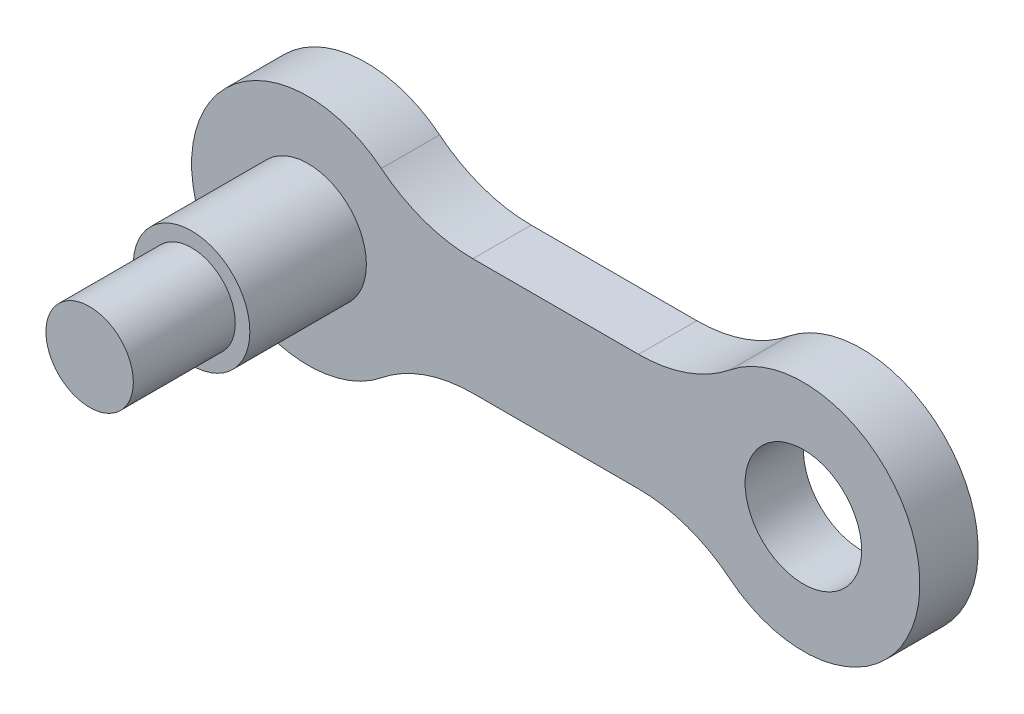
ISO-10303-21;
HEADER;
FILE_DESCRIPTION(('STEP AP214'),'2;1');
FILE_NAME('part.step','',(''),(''),'','','');
FILE_SCHEMA(('AUTOMOTIVE_DESIGN { 1 0 10303 214 1 1 1 1 }'));
ENDSEC;
DATA;
#1=APPLICATION_CONTEXT('core data for automotive mechanical design processes');
#2=APPLICATION_PROTOCOL_DEFINITION('international standard','automotive_design',2000,#1);
#3=PRODUCT_CONTEXT('',#1,'mechanical');
#4=PRODUCT('Part','Part','',(#3));
#5=PRODUCT_RELATED_PRODUCT_CATEGORY('part','',(#4));
#6=PRODUCT_DEFINITION_FORMATION('','',#4);
#7=PRODUCT_DEFINITION_CONTEXT('part definition',#1,'design');
#8=PRODUCT_DEFINITION('design','',#6,#7);
#9=PRODUCT_DEFINITION_SHAPE('','',#8);
#10=(LENGTH_UNIT() NAMED_UNIT(*) SI_UNIT(.MILLI.,.METRE.));
#11=(NAMED_UNIT(*) PLANE_ANGLE_UNIT() SI_UNIT($,.RADIAN.));
#12=(NAMED_UNIT(*) SI_UNIT($,.STERADIAN.) SOLID_ANGLE_UNIT());
#13=UNCERTAINTY_MEASURE_WITH_UNIT(LENGTH_MEASURE(1.E-05),#10,'distance_accuracy_value','');
#14=(GEOMETRIC_REPRESENTATION_CONTEXT(3) GLOBAL_UNCERTAINTY_ASSIGNED_CONTEXT((#13)) GLOBAL_UNIT_ASSIGNED_CONTEXT((#10,
#11,#12)) REPRESENTATION_CONTEXT('',''));
#15=CARTESIAN_POINT('',(0.,0.,0.));
#16=DIRECTION('',(0.,0.,1.));
#17=DIRECTION('',(1.,0.,0.));
#18=AXIS2_PLACEMENT_3D('',#15,#16,#17);
#19=CARTESIAN_POINT('',(0.,0.,9.5));
#20=DIRECTION('',(0.,0.,-1.));
#21=DIRECTION('',(-1.,0.,0.));
#22=AXIS2_PLACEMENT_3D('',#19,#20,#21);
#23=CYLINDRICAL_SURFACE('',#22,1.5);
#24=CARTESIAN_POINT('',(0.,0.,9.5));
#25=DIRECTION('',(0.,0.,1.));
#26=DIRECTION('',(1.,0.,0.));
#27=AXIS2_PLACEMENT_3D('',#24,#25,#26);
#28=CIRCLE('',#27,1.5);
#29=CARTESIAN_POINT('',(1.5,0.,9.5));
#30=VERTEX_POINT('',#29);
#31=EDGE_CURVE('E11',#30,#30,#28,.T.);
#32=ORIENTED_EDGE('',*,*,#31,.F.);
#33=EDGE_LOOP('',(#32));
#34=FACE_BOUND('',#33,.T.);
#35=CARTESIAN_POINT('',(0.,0.,6.));
#36=DIRECTION('',(0.,0.,1.));
#37=DIRECTION('',(1.,0.,0.));
#38=AXIS2_PLACEMENT_3D('',#35,#36,#37);
#39=CIRCLE('',#38,1.5);
#40=CARTESIAN_POINT('',(1.5,0.,6.));
#41=VERTEX_POINT('',#40);
#42=EDGE_CURVE('E45',#41,#41,#39,.T.);
#43=ORIENTED_EDGE('',*,*,#42,.T.);
#44=EDGE_LOOP('',(#43));
#45=FACE_BOUND('',#44,.T.);
#46=ADVANCED_FACE('F42',(#34,#45),#23,.T.);
#47=CARTESIAN_POINT('',(0.,0.,9.5));
#48=DIRECTION('',(0.,0.,1.));
#49=DIRECTION('',(1.,0.,0.));
#50=AXIS2_PLACEMENT_3D('',#47,#48,#49);
#51=PLANE('',#50);
#52=ORIENTED_EDGE('',*,*,#31,.T.);
#53=EDGE_LOOP('',(#52));
#54=FACE_BOUND('',#53,.T.);
#55=ADVANCED_FACE('F57',(#54),#51,.T.);
#56=CARTESIAN_POINT('',(0.,0.,6.));
#57=DIRECTION('',(0.,0.,1.));
#58=DIRECTION('',(1.,0.,0.));
#59=AXIS2_PLACEMENT_3D('',#56,#57,#58);
#60=PLANE('',#59);
#61=ORIENTED_EDGE('',*,*,#42,.F.);
#62=EDGE_LOOP('',(#61));
#63=FACE_BOUND('',#62,.T.);
#64=ADVANCED_FACE('F55',(#63),#60,.F.);
#65=CLOSED_SHELL('',(#46,#55,#64));
#66=MANIFOLD_SOLID_BREP('B2',#65);
#67=CARTESIAN_POINT('',(0.,0.,6.));
#68=DIRECTION('',(0.,0.,1.));
#69=DIRECTION('',(1.,0.,0.));
#70=AXIS2_PLACEMENT_3D('',#67,#68,#69);
#71=PLANE('',#70);
#72=CARTESIAN_POINT('',(0.,0.,6.));
#73=DIRECTION('',(0.,0.,1.));
#74=DIRECTION('',(1.,0.,0.));
#75=AXIS2_PLACEMENT_3D('',#72,#73,#74);
#76=CIRCLE('',#75,2.);
#77=CARTESIAN_POINT('',(2.,0.,6.));
#78=VERTEX_POINT('',#77);
#79=EDGE_CURVE('E41',#78,#78,#76,.T.);
#80=ORIENTED_EDGE('',*,*,#79,.T.);
#81=EDGE_LOOP('',(#80));
#82=FACE_BOUND('',#81,.T.);
#83=CARTESIAN_POINT('',(0.,0.,6.));
#84=DIRECTION('',(0.,0.,1.));
#85=DIRECTION('',(1.,0.,0.));
#86=AXIS2_PLACEMENT_3D('',#83,#84,#85);
#87=CIRCLE('',#86,1.5);
#88=CARTESIAN_POINT('',(1.5,0.,6.));
#89=VERTEX_POINT('',#88);
#90=EDGE_CURVE('E103',#89,#89,#87,.T.);
#91=ORIENTED_EDGE('',*,*,#90,.F.);
#92=EDGE_LOOP('',(#91));
#93=FACE_BOUND('',#92,.T.);
#94=ADVANCED_FACE('F92',(#82,#93),#71,.T.);
#95=CARTESIAN_POINT('',(0.,0.,2.));
#96=DIRECTION('',(0.,0.,1.));
#97=DIRECTION('',(1.,0.,0.));
#98=AXIS2_PLACEMENT_3D('',#95,#96,#97);
#99=PLANE('',#98);
#100=CARTESIAN_POINT('',(0.,0.,2.));
#101=DIRECTION('',(0.,0.,1.));
#102=DIRECTION('',(1.,0.,0.));
#103=AXIS2_PLACEMENT_3D('',#100,#101,#102);
#104=CIRCLE('',#103,2.);
#105=CARTESIAN_POINT('',(2.,0.,2.));
#106=VERTEX_POINT('',#105);
#107=EDGE_CURVE('E96',#106,#106,#104,.T.);
#108=ORIENTED_EDGE('',*,*,#107,.F.);
#109=EDGE_LOOP('',(#108));
#110=FACE_BOUND('',#109,.T.);
#111=CARTESIAN_POINT('',(0.,0.,2.));
#112=DIRECTION('',(0.,0.,1.));
#113=DIRECTION('',(1.,0.,0.));
#114=AXIS2_PLACEMENT_3D('',#111,#112,#113);
#115=CIRCLE('',#114,1.5);
#116=CARTESIAN_POINT('',(1.5,0.,2.));
#117=VERTEX_POINT('',#116);
#118=EDGE_CURVE('E105',#117,#117,#115,.T.);
#119=ORIENTED_EDGE('',*,*,#118,.T.);
#120=EDGE_LOOP('',(#119));
#121=FACE_BOUND('',#120,.T.);
#122=ADVANCED_FACE('F115',(#110,#121),#99,.F.);
#123=CARTESIAN_POINT('',(0.,0.,6.));
#124=DIRECTION('',(0.,0.,-1.));
#125=DIRECTION('',(-1.,0.,0.));
#126=AXIS2_PLACEMENT_3D('',#123,#124,#125);
#127=CYLINDRICAL_SURFACE('',#126,2.);
#128=ORIENTED_EDGE('',*,*,#79,.F.);
#129=EDGE_LOOP('',(#128));
#130=FACE_BOUND('',#129,.T.);
#131=ORIENTED_EDGE('',*,*,#107,.T.);
#132=EDGE_LOOP('',(#131));
#133=FACE_BOUND('',#132,.T.);
#134=ADVANCED_FACE('F94',(#130,#133),#127,.T.);
#135=CARTESIAN_POINT('',(0.,0.,6.));
#136=DIRECTION('',(0.,0.,-1.));
#137=DIRECTION('',(-1.,0.,0.));
#138=AXIS2_PLACEMENT_3D('',#135,#136,#137);
#139=CYLINDRICAL_SURFACE('',#138,1.5);
#140=ORIENTED_EDGE('',*,*,#90,.T.);
#141=EDGE_LOOP('',(#140));
#142=FACE_BOUND('',#141,.T.);
#143=ORIENTED_EDGE('',*,*,#118,.F.);
#144=EDGE_LOOP('',(#143));
#145=FACE_BOUND('',#144,.T.);
#146=ADVANCED_FACE('F111',(#142,#145),#139,.F.);
#147=CLOSED_SHELL('',(#94,#122,#134,#146));
#148=MANIFOLD_SOLID_BREP('B6',#147);
#149=CARTESIAN_POINT('',(5.65685424949238,-7.,2.));
#150=DIRECTION('',(0.,0.,-1.));
#151=DIRECTION('',(-1.,0.,0.));
#152=AXIS2_PLACEMENT_3D('',#149,#150,#151);
#153=CYLINDRICAL_SURFACE('',#152,5.);
#154=CARTESIAN_POINT('',(5.65685424949238,-7.,0.));
#155=DIRECTION('',(0.,0.,1.));
#156=DIRECTION('',(1.,0.,0.));
#157=AXIS2_PLACEMENT_3D('',#154,#155,#156);
#158=CIRCLE('',#157,5.);
#159=CARTESIAN_POINT('',(5.65685424949238,-2.,0.));
#160=VERTEX_POINT('',#159);
#161=CARTESIAN_POINT('',(2.51415744421883,-3.11111111111111,0.));
#162=VERTEX_POINT('',#161);
#163=EDGE_CURVE('E254',#160,#162,#158,.T.);
#164=ORIENTED_EDGE('',*,*,#163,.F.);
#165=DIRECTION('',(0.,0.,-1.));
#166=VECTOR('',#165,1.);
#167=CARTESIAN_POINT('',(5.65685424949238,-2.,2.));
#168=LINE('',#167,#166);
#169=CARTESIAN_POINT('',(5.65685424949238,-2.,2.));
#170=VERTEX_POINT('',#169);
#171=EDGE_CURVE('E90',#170,#160,#168,.T.);
#172=ORIENTED_EDGE('',*,*,#171,.F.);
#173=CARTESIAN_POINT('',(5.65685424949238,-7.,2.));
#174=DIRECTION('',(0.,0.,1.));
#175=DIRECTION('',(1.,0.,0.));
#176=AXIS2_PLACEMENT_3D('',#173,#174,#175);
#177=CIRCLE('',#176,5.);
#178=CARTESIAN_POINT('',(2.51415744421883,-3.11111111111111,2.));
#179=VERTEX_POINT('',#178);
#180=EDGE_CURVE('E303',#170,#179,#177,.T.);
#181=ORIENTED_EDGE('',*,*,#180,.T.);
#182=DIRECTION('',(0.,0.,-1.));
#183=VECTOR('',#182,1.);
#184=CARTESIAN_POINT('',(2.51415744421883,-3.11111111111111,2.));
#185=LINE('',#184,#183);
#186=EDGE_CURVE('E205',#179,#162,#185,.T.);
#187=ORIENTED_EDGE('',*,*,#186,.T.);
#188=EDGE_LOOP('',(#164,#172,#181,#187));
#189=FACE_BOUND('',#188,.T.);
#190=ADVANCED_FACE('F154',(#189),#153,.F.);
#191=CARTESIAN_POINT('',(0.,-2.,2.));
#192=DIRECTION('',(0.,1.,0.));
#193=DIRECTION('',(0.,0.,1.));
#194=AXIS2_PLACEMENT_3D('',#191,#192,#193);
#195=PLANE('',#194);
#196=DIRECTION('',(1.,0.,0.));
#197=VECTOR('',#196,1.);
#198=CARTESIAN_POINT('',(0.,-2.,0.));
#199=LINE('',#198,#197);
#200=CARTESIAN_POINT('',(11.3431457505076,-2.,0.));
#201=VERTEX_POINT('',#200);
#202=EDGE_CURVE('E257',#160,#201,#199,.T.);
#203=ORIENTED_EDGE('',*,*,#202,.T.);
#204=DIRECTION('',(0.,0.,-1.));
#205=VECTOR('',#204,1.);
#206=CARTESIAN_POINT('',(11.3431457505076,-2.,2.));
#207=LINE('',#206,#205);
#208=CARTESIAN_POINT('',(11.3431457505076,-2.,2.));
#209=VERTEX_POINT('',#208);
#210=EDGE_CURVE('E163',#209,#201,#207,.T.);
#211=ORIENTED_EDGE('',*,*,#210,.F.);
#212=DIRECTION('',(1.,0.,0.));
#213=VECTOR('',#212,1.);
#214=CARTESIAN_POINT('',(0.,-2.,2.));
#215=LINE('',#214,#213);
#216=EDGE_CURVE('E301',#170,#209,#215,.T.);
#217=ORIENTED_EDGE('',*,*,#216,.F.);
#218=ORIENTED_EDGE('',*,*,#171,.T.);
#219=EDGE_LOOP('',(#203,#211,#217,#218));
#220=FACE_BOUND('',#219,.T.);
#221=ADVANCED_FACE('F291',(#220),#195,.F.);
#222=CARTESIAN_POINT('',(11.3431457505076,-7.,2.));
#223=DIRECTION('',(0.,0.,-1.));
#224=DIRECTION('',(-1.,0.,0.));
#225=AXIS2_PLACEMENT_3D('',#222,#223,#224);
#226=CYLINDRICAL_SURFACE('',#225,5.);
#227=CARTESIAN_POINT('',(11.3431457505076,-7.,0.));
#228=DIRECTION('',(0.,0.,1.));
#229=DIRECTION('',(1.,0.,0.));
#230=AXIS2_PLACEMENT_3D('',#227,#228,#229);
#231=CIRCLE('',#230,5.);
#232=CARTESIAN_POINT('',(14.4858425557812,-3.11111111111111,0.));
#233=VERTEX_POINT('',#232);
#234=EDGE_CURVE('E260',#233,#201,#231,.T.);
#235=ORIENTED_EDGE('',*,*,#234,.F.);
#236=DIRECTION('',(0.,0.,-1.));
#237=VECTOR('',#236,1.);
#238=CARTESIAN_POINT('',(14.4858425557812,-3.11111111111111,2.));
#239=LINE('',#238,#237);
#240=CARTESIAN_POINT('',(14.4858425557812,-3.11111111111111,2.));
#241=VERTEX_POINT('',#240);
#242=EDGE_CURVE('E281',#241,#233,#239,.T.);
#243=ORIENTED_EDGE('',*,*,#242,.F.);
#244=CARTESIAN_POINT('',(11.3431457505076,-7.,2.));
#245=DIRECTION('',(0.,0.,1.));
#246=DIRECTION('',(1.,0.,0.));
#247=AXIS2_PLACEMENT_3D('',#244,#245,#246);
#248=CIRCLE('',#247,5.);
#249=EDGE_CURVE('E288',#241,#209,#248,.T.);
#250=ORIENTED_EDGE('',*,*,#249,.T.);
#251=ORIENTED_EDGE('',*,*,#210,.T.);
#252=EDGE_LOOP('',(#235,#243,#250,#251));
#253=FACE_BOUND('',#252,.T.);
#254=ADVANCED_FACE('F286',(#253),#226,.F.);
#255=CARTESIAN_POINT('',(17.,0.,2.));
#256=DIRECTION('',(0.,0.,-1.));
#257=DIRECTION('',(-1.,0.,0.));
#258=AXIS2_PLACEMENT_3D('',#255,#256,#257);
#259=CYLINDRICAL_SURFACE('',#258,4.);
#260=CARTESIAN_POINT('',(17.,0.,0.));
#261=DIRECTION('',(0.,0.,1.));
#262=DIRECTION('',(1.,0.,0.));
#263=AXIS2_PLACEMENT_3D('',#260,#261,#262);
#264=CIRCLE('',#263,4.);
#265=CARTESIAN_POINT('',(14.4858425557812,3.11111111111111,0.));
#266=VERTEX_POINT('',#265);
#267=EDGE_CURVE('E263',#233,#266,#264,.T.);
#268=ORIENTED_EDGE('',*,*,#267,.T.);
#269=DIRECTION('',(0.,0.,-1.));
#270=VECTOR('',#269,1.);
#271=CARTESIAN_POINT('',(14.4858425557812,3.11111111111111,2.));
#272=LINE('',#271,#270);
#273=CARTESIAN_POINT('',(14.4858425557812,3.11111111111111,2.));
#274=VERTEX_POINT('',#273);
#275=EDGE_CURVE('E278',#274,#266,#272,.T.);
#276=ORIENTED_EDGE('',*,*,#275,.F.);
#277=CARTESIAN_POINT('',(17.,0.,2.));
#278=DIRECTION('',(0.,0.,1.));
#279=DIRECTION('',(1.,0.,0.));
#280=AXIS2_PLACEMENT_3D('',#277,#278,#279);
#281=CIRCLE('',#280,4.);
#282=EDGE_CURVE('E299',#241,#274,#281,.T.);
#283=ORIENTED_EDGE('',*,*,#282,.F.);
#284=ORIENTED_EDGE('',*,*,#242,.T.);
#285=EDGE_LOOP('',(#268,#276,#283,#284));
#286=FACE_BOUND('',#285,.T.);
#287=ADVANCED_FACE('F297',(#286),#259,.T.);
#288=CARTESIAN_POINT('',(11.3431457505076,7.,2.));
#289=DIRECTION('',(0.,0.,-1.));
#290=DIRECTION('',(-1.,0.,0.));
#291=AXIS2_PLACEMENT_3D('',#288,#289,#290);
#292=CYLINDRICAL_SURFACE('',#291,5.);
#293=CARTESIAN_POINT('',(11.3431457505076,7.,0.));
#294=DIRECTION('',(0.,0.,1.));
#295=DIRECTION('',(1.,0.,0.));
#296=AXIS2_PLACEMENT_3D('',#293,#294,#295);
#297=CIRCLE('',#296,5.);
#298=CARTESIAN_POINT('',(11.3431457505076,2.,0.));
#299=VERTEX_POINT('',#298);
#300=EDGE_CURVE('E266',#266,#299,#297,.F.);
#301=ORIENTED_EDGE('',*,*,#300,.T.);
#302=DIRECTION('',(0.,0.,-1.));
#303=VECTOR('',#302,1.);
#304=CARTESIAN_POINT('',(11.3431457505076,2.,2.));
#305=LINE('',#304,#303);
#306=CARTESIAN_POINT('',(11.3431457505076,2.,2.));
#307=VERTEX_POINT('',#306);
#308=EDGE_CURVE('E235',#307,#299,#305,.T.);
#309=ORIENTED_EDGE('',*,*,#308,.F.);
#310=CARTESIAN_POINT('',(11.3431457505076,7.,2.));
#311=DIRECTION('',(0.,0.,1.));
#312=DIRECTION('',(1.,0.,0.));
#313=AXIS2_PLACEMENT_3D('',#310,#311,#312);
#314=CIRCLE('',#313,5.);
#315=EDGE_CURVE('E240',#274,#307,#314,.F.);
#316=ORIENTED_EDGE('',*,*,#315,.F.);
#317=ORIENTED_EDGE('',*,*,#275,.T.);
#318=EDGE_LOOP('',(#301,#309,#316,#317));
#319=FACE_BOUND('',#318,.T.);
#320=ADVANCED_FACE('F343',(#319),#292,.F.);
#321=CARTESIAN_POINT('',(0.,2.,2.));
#322=DIRECTION('',(0.,1.,0.));
#323=DIRECTION('',(0.,0.,1.));
#324=AXIS2_PLACEMENT_3D('',#321,#322,#323);
#325=PLANE('',#324);
#326=DIRECTION('',(1.,0.,0.));
#327=VECTOR('',#326,1.);
#328=CARTESIAN_POINT('',(0.,2.,0.));
#329=LINE('',#328,#327);
#330=CARTESIAN_POINT('',(5.65685424949238,2.,0.));
#331=VERTEX_POINT('',#330);
#332=EDGE_CURVE('E230',#331,#299,#329,.T.);
#333=ORIENTED_EDGE('',*,*,#332,.F.);
#334=DIRECTION('',(0.,0.,-1.));
#335=VECTOR('',#334,1.);
#336=CARTESIAN_POINT('',(5.65685424949238,2.,2.));
#337=LINE('',#336,#335);
#338=CARTESIAN_POINT('',(5.65685424949238,2.,2.));
#339=VERTEX_POINT('',#338);
#340=EDGE_CURVE('E225',#339,#331,#337,.T.);
#341=ORIENTED_EDGE('',*,*,#340,.F.);
#342=DIRECTION('',(1.,0.,0.));
#343=VECTOR('',#342,1.);
#344=CARTESIAN_POINT('',(0.,2.,2.));
#345=LINE('',#344,#343);
#346=EDGE_CURVE('E228',#339,#307,#345,.T.);
#347=ORIENTED_EDGE('',*,*,#346,.T.);
#348=ORIENTED_EDGE('',*,*,#308,.T.);
#349=EDGE_LOOP('',(#333,#341,#347,#348));
#350=FACE_BOUND('',#349,.T.);
#351=ADVANCED_FACE('F227',(#350),#325,.T.);
#352=CARTESIAN_POINT('',(5.65685424949238,7.,2.));
#353=DIRECTION('',(0.,0.,-1.));
#354=DIRECTION('',(-1.,0.,0.));
#355=AXIS2_PLACEMENT_3D('',#352,#353,#354);
#356=CYLINDRICAL_SURFACE('',#355,5.);
#357=CARTESIAN_POINT('',(5.65685424949238,7.,0.));
#358=DIRECTION('',(0.,0.,1.));
#359=DIRECTION('',(1.,0.,0.));
#360=AXIS2_PLACEMENT_3D('',#357,#358,#359);
#361=CIRCLE('',#360,5.);
#362=CARTESIAN_POINT('',(2.51415744421884,3.11111111111111,0.));
#363=VERTEX_POINT('',#362);
#364=EDGE_CURVE('E270',#363,#331,#361,.T.);
#365=ORIENTED_EDGE('',*,*,#364,.F.);
#366=DIRECTION('',(0.,0.,-1.));
#367=VECTOR('',#366,1.);
#368=CARTESIAN_POINT('',(2.51415744421884,3.11111111111111,2.));
#369=LINE('',#368,#367);
#370=CARTESIAN_POINT('',(2.51415744421884,3.11111111111111,2.));
#371=VERTEX_POINT('',#370);
#372=EDGE_CURVE('E198',#371,#363,#369,.T.);
#373=ORIENTED_EDGE('',*,*,#372,.F.);
#374=CARTESIAN_POINT('',(5.65685424949238,7.,2.));
#375=DIRECTION('',(0.,0.,1.));
#376=DIRECTION('',(1.,0.,0.));
#377=AXIS2_PLACEMENT_3D('',#374,#375,#376);
#378=CIRCLE('',#377,5.);
#379=EDGE_CURVE('E238',#371,#339,#378,.T.);
#380=ORIENTED_EDGE('',*,*,#379,.T.);
#381=ORIENTED_EDGE('',*,*,#340,.T.);
#382=EDGE_LOOP('',(#365,#373,#380,#381));
#383=FACE_BOUND('',#382,.T.);
#384=ADVANCED_FACE('F243',(#383),#356,.F.);
#385=CARTESIAN_POINT('',(0.,0.,2.));
#386=DIRECTION('',(0.,0.,-1.));
#387=DIRECTION('',(-1.,0.,0.));
#388=AXIS2_PLACEMENT_3D('',#385,#386,#387);
#389=CYLINDRICAL_SURFACE('',#388,2.);
#390=CARTESIAN_POINT('',(0.,0.,2.));
#391=DIRECTION('',(0.,0.,1.));
#392=DIRECTION('',(1.,0.,0.));
#393=AXIS2_PLACEMENT_3D('',#390,#391,#392);
#394=CIRCLE('',#393,2.);
#395=CARTESIAN_POINT('',(2.,0.,2.));
#396=VERTEX_POINT('',#395);
#397=EDGE_CURVE('E307',#396,#396,#394,.T.);
#398=ORIENTED_EDGE('',*,*,#397,.T.);
#399=EDGE_LOOP('',(#398));
#400=FACE_BOUND('',#399,.T.);
#401=CARTESIAN_POINT('',(0.,0.,0.));
#402=DIRECTION('',(0.,0.,1.));
#403=DIRECTION('',(1.,0.,0.));
#404=AXIS2_PLACEMENT_3D('',#401,#402,#403);
#405=CIRCLE('',#404,2.);
#406=CARTESIAN_POINT('',(2.,0.,0.));
#407=VERTEX_POINT('',#406);
#408=EDGE_CURVE('E251',#407,#407,#405,.T.);
#409=ORIENTED_EDGE('',*,*,#408,.F.);
#410=EDGE_LOOP('',(#409));
#411=FACE_BOUND('',#410,.T.);
#412=ADVANCED_FACE('F321',(#400,#411),#389,.F.);
#413=CARTESIAN_POINT('',(17.,0.,2.));
#414=DIRECTION('',(0.,0.,-1.));
#415=DIRECTION('',(-1.,0.,0.));
#416=AXIS2_PLACEMENT_3D('',#413,#414,#415);
#417=CYLINDRICAL_SURFACE('',#416,2.);
#418=CARTESIAN_POINT('',(17.,0.,2.));
#419=DIRECTION('',(0.,0.,1.));
#420=DIRECTION('',(1.,0.,0.));
#421=AXIS2_PLACEMENT_3D('',#418,#419,#420);
#422=CIRCLE('',#421,2.);
#423=CARTESIAN_POINT('',(19.,0.,2.));
#424=VERTEX_POINT('',#423);
#425=EDGE_CURVE('E274',#424,#424,#422,.T.);
#426=ORIENTED_EDGE('',*,*,#425,.T.);
#427=EDGE_LOOP('',(#426));
#428=FACE_BOUND('',#427,.T.);
#429=CARTESIAN_POINT('',(17.,0.,0.));
#430=DIRECTION('',(0.,0.,1.));
#431=DIRECTION('',(1.,0.,0.));
#432=AXIS2_PLACEMENT_3D('',#429,#430,#431);
#433=CIRCLE('',#432,2.);
#434=CARTESIAN_POINT('',(19.,0.,0.));
#435=VERTEX_POINT('',#434);
#436=EDGE_CURVE('E248',#435,#435,#433,.T.);
#437=ORIENTED_EDGE('',*,*,#436,.F.);
#438=EDGE_LOOP('',(#437));
#439=FACE_BOUND('',#438,.T.);
#440=ADVANCED_FACE('F156',(#428,#439),#417,.F.);
#441=CARTESIAN_POINT('',(0.,0.,2.));
#442=DIRECTION('',(0.,0.,-1.));
#443=DIRECTION('',(-1.,0.,0.));
#444=AXIS2_PLACEMENT_3D('',#441,#442,#443);
#445=CYLINDRICAL_SURFACE('',#444,4.);
#446=CARTESIAN_POINT('',(0.,0.,0.));
#447=DIRECTION('',(0.,0.,1.));
#448=DIRECTION('',(1.,0.,0.));
#449=AXIS2_PLACEMENT_3D('',#446,#447,#448);
#450=CIRCLE('',#449,4.);
#451=EDGE_CURVE('E272',#363,#162,#450,.T.);
#452=ORIENTED_EDGE('',*,*,#451,.T.);
#453=ORIENTED_EDGE('',*,*,#186,.F.);
#454=CARTESIAN_POINT('',(0.,0.,2.));
#455=DIRECTION('',(0.,0.,1.));
#456=DIRECTION('',(1.,0.,0.));
#457=AXIS2_PLACEMENT_3D('',#454,#455,#456);
#458=CIRCLE('',#457,4.);
#459=EDGE_CURVE('E171',#371,#179,#458,.T.);
#460=ORIENTED_EDGE('',*,*,#459,.F.);
#461=ORIENTED_EDGE('',*,*,#372,.T.);
#462=EDGE_LOOP('',(#452,#453,#460,#461));
#463=FACE_BOUND('',#462,.T.);
#464=ADVANCED_FACE('F317',(#463),#445,.T.);
#465=CARTESIAN_POINT('',(0.,0.,2.));
#466=DIRECTION('',(0.,0.,1.));
#467=DIRECTION('',(1.,0.,0.));
#468=AXIS2_PLACEMENT_3D('',#465,#466,#467);
#469=PLANE('',#468);
#470=ORIENTED_EDGE('',*,*,#425,.F.);
#471=EDGE_LOOP('',(#470));
#472=FACE_BOUND('',#471,.T.);
#473=ORIENTED_EDGE('',*,*,#397,.F.);
#474=EDGE_LOOP('',(#473));
#475=FACE_BOUND('',#474,.T.);
#476=ORIENTED_EDGE('',*,*,#180,.F.);
#477=ORIENTED_EDGE('',*,*,#216,.T.);
#478=ORIENTED_EDGE('',*,*,#249,.F.);
#479=ORIENTED_EDGE('',*,*,#282,.T.);
#480=ORIENTED_EDGE('',*,*,#315,.T.);
#481=ORIENTED_EDGE('',*,*,#346,.F.);
#482=ORIENTED_EDGE('',*,*,#379,.F.);
#483=ORIENTED_EDGE('',*,*,#459,.T.);
#484=EDGE_LOOP('',(#476,#477,#478,#479,#480,#481,#482,#483));
#485=FACE_BOUND('',#484,.T.);
#486=ADVANCED_FACE('F237',(#472,#475,#485),#469,.T.);
#487=CARTESIAN_POINT('',(0.,0.,0.));
#488=DIRECTION('',(0.,0.,1.));
#489=DIRECTION('',(1.,0.,0.));
#490=AXIS2_PLACEMENT_3D('',#487,#488,#489);
#491=PLANE('',#490);
#492=ORIENTED_EDGE('',*,*,#436,.T.);
#493=EDGE_LOOP('',(#492));
#494=FACE_BOUND('',#493,.T.);
#495=ORIENTED_EDGE('',*,*,#408,.T.);
#496=EDGE_LOOP('',(#495));
#497=FACE_BOUND('',#496,.T.);
#498=ORIENTED_EDGE('',*,*,#163,.T.);
#499=ORIENTED_EDGE('',*,*,#451,.F.);
#500=ORIENTED_EDGE('',*,*,#364,.T.);
#501=ORIENTED_EDGE('',*,*,#332,.T.);
#502=ORIENTED_EDGE('',*,*,#300,.F.);
#503=ORIENTED_EDGE('',*,*,#267,.F.);
#504=ORIENTED_EDGE('',*,*,#234,.T.);
#505=ORIENTED_EDGE('',*,*,#202,.F.);
#506=EDGE_LOOP('',(#498,#499,#500,#501,#502,#503,#504,#505));
#507=FACE_BOUND('',#506,.T.);
#508=ADVANCED_FACE('F294',(#494,#497,#507),#491,.F.);
#509=CLOSED_SHELL('',(#190,#221,#254,#287,#320,#351,#384,#412,#440,#464,#486,#508));
#510=MANIFOLD_SOLID_BREP('B36',#509);
#511=ADVANCED_BREP_SHAPE_REPRESENTATION('',(#18,#66,#148,#510),#14);
#512=SHAPE_DEFINITION_REPRESENTATION(#9,#511);
ENDSEC;
END-ISO-10303-21;
